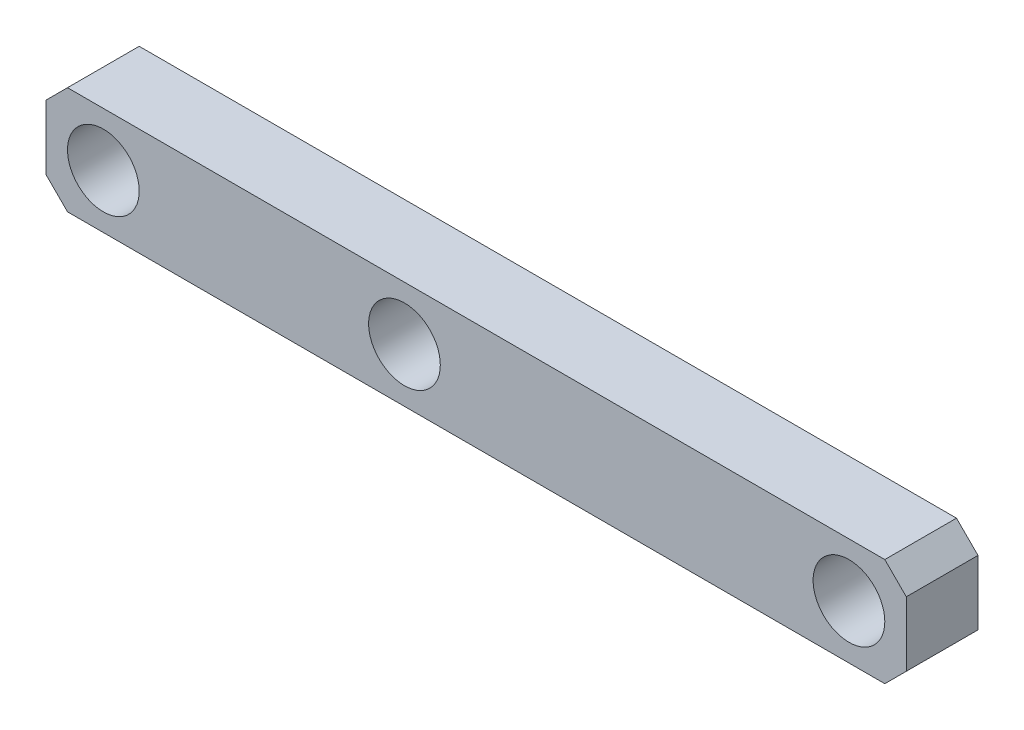
ISO-10303-21;
HEADER;
FILE_DESCRIPTION(('STEP AP214'),'2;1');
FILE_NAME('part.step','',(''),(''),'','','');
FILE_SCHEMA(('AUTOMOTIVE_DESIGN { 1 0 10303 214 1 1 1 1 }'));
ENDSEC;
DATA;
#1=APPLICATION_CONTEXT('core data for automotive mechanical design processes');
#2=APPLICATION_PROTOCOL_DEFINITION('international standard','automotive_design',2000,#1);
#3=PRODUCT_CONTEXT('',#1,'mechanical');
#4=PRODUCT('Part','Part','',(#3));
#5=PRODUCT_RELATED_PRODUCT_CATEGORY('part','',(#4));
#6=PRODUCT_DEFINITION_FORMATION('','',#4);
#7=PRODUCT_DEFINITION_CONTEXT('part definition',#1,'design');
#8=PRODUCT_DEFINITION('design','',#6,#7);
#9=PRODUCT_DEFINITION_SHAPE('','',#8);
#10=(LENGTH_UNIT() NAMED_UNIT(*) SI_UNIT(.MILLI.,.METRE.));
#11=(NAMED_UNIT(*) PLANE_ANGLE_UNIT() SI_UNIT($,.RADIAN.));
#12=(NAMED_UNIT(*) SI_UNIT($,.STERADIAN.) SOLID_ANGLE_UNIT());
#13=UNCERTAINTY_MEASURE_WITH_UNIT(LENGTH_MEASURE(1.E-05),#10,'distance_accuracy_value','');
#14=(GEOMETRIC_REPRESENTATION_CONTEXT(3) GLOBAL_UNCERTAINTY_ASSIGNED_CONTEXT((#13)) GLOBAL_UNIT_ASSIGNED_CONTEXT((#10,
#11,#12)) REPRESENTATION_CONTEXT('',''));
#15=CARTESIAN_POINT('',(0.,0.,0.));
#16=DIRECTION('',(0.,0.,1.));
#17=DIRECTION('',(1.,0.,0.));
#18=AXIS2_PLACEMENT_3D('',#15,#16,#17);
#19=CARTESIAN_POINT('',(0.,0.,10.));
#20=DIRECTION('',(0.,0.,1.));
#21=DIRECTION('',(1.,0.,0.));
#22=AXIS2_PLACEMENT_3D('',#19,#20,#21);
#23=PLANE('',#22);
#24=CARTESIAN_POINT('',(39.0096463022508,6.14951768488746,10.));
#25=DIRECTION('',(0.,0.,1.));
#26=DIRECTION('',(1.,0.,0.));
#27=AXIS2_PLACEMENT_3D('',#24,#25,#26);
#28=CIRCLE('',#27,5.);
#29=CARTESIAN_POINT('',(44.0096463022508,6.14951768488746,10.));
#30=VERTEX_POINT('',#29);
#31=EDGE_CURVE('E187',#30,#30,#28,.T.);
#32=ORIENTED_EDGE('',*,*,#31,.F.);
#33=EDGE_LOOP('',(#32));
#34=FACE_BOUND('',#33,.T.);
#35=DIRECTION('',(1.,0.,0.));
#36=VECTOR('',#35,1.);
#37=CARTESIAN_POINT('',(-72.9903536977492,-1.35048231511253,10.));
#38=LINE('',#37,#36);
#39=CARTESIAN_POINT('',(-69.9903536977492,-1.35048231511253,10.));
#40=VERTEX_POINT('',#39);
#41=CARTESIAN_POINT('',(44.0096463022507,-1.35048231511253,10.));
#42=VERTEX_POINT('',#41);
#43=EDGE_CURVE('E143',#40,#42,#38,.T.);
#44=ORIENTED_EDGE('',*,*,#43,.T.);
#45=DIRECTION('',(-0.707106781186551,-0.707106781186544,0.));
#46=VECTOR('',#45,1.);
#47=CARTESIAN_POINT('',(22.6800643086814,-22.6800643086816,10.));
#48=LINE('',#47,#46);
#49=CARTESIAN_POINT('',(47.0096463022508,1.64951768488748,10.));
#50=VERTEX_POINT('',#49);
#51=EDGE_CURVE('E162',#42,#50,#48,.F.);
#52=ORIENTED_EDGE('',*,*,#51,.T.);
#53=DIRECTION('',(0.,1.,0.));
#54=VECTOR('',#53,1.);
#55=CARTESIAN_POINT('',(47.0096463022508,13.6495176848875,10.));
#56=LINE('',#55,#54);
#57=CARTESIAN_POINT('',(47.0096463022508,10.6495176848874,10.));
#58=VERTEX_POINT('',#57);
#59=EDGE_CURVE('E126',#50,#58,#56,.T.);
#60=ORIENTED_EDGE('',*,*,#59,.T.);
#61=DIRECTION('',(0.707106781186544,-0.707106781186551,0.));
#62=VECTOR('',#61,1.);
#63=CARTESIAN_POINT('',(28.8295819935693,28.8295819935691,10.));
#64=LINE('',#63,#62);
#65=CARTESIAN_POINT('',(44.0096463022508,13.6495176848875,10.));
#66=VERTEX_POINT('',#65);
#67=EDGE_CURVE('E160',#58,#66,#64,.F.);
#68=ORIENTED_EDGE('',*,*,#67,.T.);
#69=DIRECTION('',(-1.,0.,0.));
#70=VECTOR('',#69,1.);
#71=CARTESIAN_POINT('',(-72.9903536977492,13.6495176848875,10.));
#72=LINE('',#71,#70);
#73=CARTESIAN_POINT('',(-69.9903536977492,13.6495176848875,10.));
#74=VERTEX_POINT('',#73);
#75=EDGE_CURVE('E182',#66,#74,#72,.T.);
#76=ORIENTED_EDGE('',*,*,#75,.T.);
#77=DIRECTION('',(0.707106781186551,0.707106781186544,0.));
#78=VECTOR('',#77,1.);
#79=CARTESIAN_POINT('',(-41.819935691318,41.8199356913184,10.));
#80=LINE('',#79,#78);
#81=CARTESIAN_POINT('',(-72.9903536977492,10.6495176848874,10.));
#82=VERTEX_POINT('',#81);
#83=EDGE_CURVE('E61',#74,#82,#80,.F.);
#84=ORIENTED_EDGE('',*,*,#83,.T.);
#85=DIRECTION('',(0.,-1.,0.));
#86=VECTOR('',#85,1.);
#87=CARTESIAN_POINT('',(-72.9903536977492,13.6495176848875,10.));
#88=LINE('',#87,#86);
#89=CARTESIAN_POINT('',(-72.9903536977492,1.64951768488748,10.));
#90=VERTEX_POINT('',#89);
#91=EDGE_CURVE('E172',#82,#90,#88,.T.);
#92=ORIENTED_EDGE('',*,*,#91,.T.);
#93=DIRECTION('',(-0.707106781186544,0.707106781186551,0.));
#94=VECTOR('',#93,1.);
#95=CARTESIAN_POINT('',(-35.6704180064312,-35.6704180064309,10.));
#96=LINE('',#95,#94);
#97=EDGE_CURVE('E158',#90,#40,#96,.F.);
#98=ORIENTED_EDGE('',*,*,#97,.T.);
#99=EDGE_LOOP('',(#44,#52,#60,#68,#76,#84,#92,#98));
#100=FACE_BOUND('',#99,.T.);
#101=CARTESIAN_POINT('',(-64.9903536977492,6.14951768488746,10.));
#102=DIRECTION('',(0.,0.,1.));
#103=DIRECTION('',(1.,0.,0.));
#104=AXIS2_PLACEMENT_3D('',#101,#102,#103);
#105=CIRCLE('',#104,5.);
#106=CARTESIAN_POINT('',(-59.9903536977492,6.14951768488746,10.));
#107=VERTEX_POINT('',#106);
#108=EDGE_CURVE('E134',#107,#107,#105,.T.);
#109=ORIENTED_EDGE('',*,*,#108,.F.);
#110=EDGE_LOOP('',(#109));
#111=FACE_BOUND('',#110,.T.);
#112=CARTESIAN_POINT('',(-22.9903536977492,6.14951768488746,10.));
#113=DIRECTION('',(0.,0.,1.));
#114=DIRECTION('',(1.,0.,0.));
#115=AXIS2_PLACEMENT_3D('',#112,#113,#114);
#116=CIRCLE('',#115,5.);
#117=CARTESIAN_POINT('',(-17.9903536977492,6.14951768488746,10.));
#118=VERTEX_POINT('',#117);
#119=EDGE_CURVE('E192',#118,#118,#116,.T.);
#120=ORIENTED_EDGE('',*,*,#119,.F.);
#121=EDGE_LOOP('',(#120));
#122=FACE_BOUND('',#121,.T.);
#123=ADVANCED_FACE('F40',(#34,#100,#111,#122),#23,.T.);
#124=CARTESIAN_POINT('',(0.,0.,0.));
#125=DIRECTION('',(0.,0.,1.));
#126=DIRECTION('',(1.,0.,0.));
#127=AXIS2_PLACEMENT_3D('',#124,#125,#126);
#128=PLANE('',#127);
#129=DIRECTION('',(0.,1.,0.));
#130=VECTOR('',#129,1.);
#131=CARTESIAN_POINT('',(47.0096463022508,13.6495176848875,0.));
#132=LINE('',#131,#130);
#133=CARTESIAN_POINT('',(47.0096463022508,1.64951768488748,0.));
#134=VERTEX_POINT('',#133);
#135=CARTESIAN_POINT('',(47.0096463022508,10.6495176848874,0.));
#136=VERTEX_POINT('',#135);
#137=EDGE_CURVE('E123',#134,#136,#132,.T.);
#138=ORIENTED_EDGE('',*,*,#137,.F.);
#139=DIRECTION('',(0.707106781186551,0.707106781186544,0.));
#140=VECTOR('',#139,1.);
#141=CARTESIAN_POINT('',(47.0096463022508,1.64951768488748,0.));
#142=LINE('',#141,#140);
#143=CARTESIAN_POINT('',(44.0096463022507,-1.35048231511253,0.));
#144=VERTEX_POINT('',#143);
#145=EDGE_CURVE('E106',#134,#144,#142,.F.);
#146=ORIENTED_EDGE('',*,*,#145,.T.);
#147=DIRECTION('',(1.,0.,0.));
#148=VECTOR('',#147,1.);
#149=CARTESIAN_POINT('',(-72.9903536977492,-1.35048231511253,0.));
#150=LINE('',#149,#148);
#151=CARTESIAN_POINT('',(-69.9903536977492,-1.35048231511253,0.));
#152=VERTEX_POINT('',#151);
#153=EDGE_CURVE('E147',#152,#144,#150,.T.);
#154=ORIENTED_EDGE('',*,*,#153,.F.);
#155=DIRECTION('',(0.707106781186544,-0.707106781186551,0.));
#156=VECTOR('',#155,1.);
#157=CARTESIAN_POINT('',(-69.9903536977492,-1.35048231511253,0.));
#158=LINE('',#157,#156);
#159=CARTESIAN_POINT('',(-72.9903536977492,1.64951768488748,0.));
#160=VERTEX_POINT('',#159);
#161=EDGE_CURVE('E151',#152,#160,#158,.F.);
#162=ORIENTED_EDGE('',*,*,#161,.T.);
#163=DIRECTION('',(0.,-1.,0.));
#164=VECTOR('',#163,1.);
#165=CARTESIAN_POINT('',(-72.9903536977492,13.6495176848875,0.));
#166=LINE('',#165,#164);
#167=CARTESIAN_POINT('',(-72.9903536977492,10.6495176848874,0.));
#168=VERTEX_POINT('',#167);
#169=EDGE_CURVE('E137',#168,#160,#166,.T.);
#170=ORIENTED_EDGE('',*,*,#169,.F.);
#171=DIRECTION('',(-0.707106781186551,-0.707106781186544,0.));
#172=VECTOR('',#171,1.);
#173=CARTESIAN_POINT('',(-72.9903536977492,10.6495176848874,0.));
#174=LINE('',#173,#172);
#175=CARTESIAN_POINT('',(-69.9903536977492,13.6495176848875,0.));
#176=VERTEX_POINT('',#175);
#177=EDGE_CURVE('E127',#168,#176,#174,.F.);
#178=ORIENTED_EDGE('',*,*,#177,.T.);
#179=DIRECTION('',(-1.,0.,0.));
#180=VECTOR('',#179,1.);
#181=CARTESIAN_POINT('',(-72.9903536977492,13.6495176848875,0.));
#182=LINE('',#181,#180);
#183=CARTESIAN_POINT('',(44.0096463022508,13.6495176848875,0.));
#184=VERTEX_POINT('',#183);
#185=EDGE_CURVE('E133',#184,#176,#182,.T.);
#186=ORIENTED_EDGE('',*,*,#185,.F.);
#187=DIRECTION('',(-0.707106781186544,0.707106781186551,0.));
#188=VECTOR('',#187,1.);
#189=CARTESIAN_POINT('',(44.0096463022508,13.6495176848875,0.));
#190=LINE('',#189,#188);
#191=EDGE_CURVE('E117',#184,#136,#190,.F.);
#192=ORIENTED_EDGE('',*,*,#191,.T.);
#193=EDGE_LOOP('',(#138,#146,#154,#162,#170,#178,#186,#192));
#194=FACE_BOUND('',#193,.T.);
#195=CARTESIAN_POINT('',(-64.9903536977492,6.14951768488746,0.));
#196=DIRECTION('',(0.,0.,1.));
#197=DIRECTION('',(1.,0.,0.));
#198=AXIS2_PLACEMENT_3D('',#195,#196,#197);
#199=CIRCLE('',#198,5.);
#200=CARTESIAN_POINT('',(-59.9903536977492,6.14951768488746,0.));
#201=VERTEX_POINT('',#200);
#202=EDGE_CURVE('E140',#201,#201,#199,.T.);
#203=ORIENTED_EDGE('',*,*,#202,.T.);
#204=EDGE_LOOP('',(#203));
#205=FACE_BOUND('',#204,.T.);
#206=CARTESIAN_POINT('',(39.0096463022508,6.14951768488746,0.));
#207=DIRECTION('',(0.,0.,1.));
#208=DIRECTION('',(1.,0.,0.));
#209=AXIS2_PLACEMENT_3D('',#206,#207,#208);
#210=CIRCLE('',#209,5.);
#211=CARTESIAN_POINT('',(44.0096463022508,6.14951768488746,0.));
#212=VERTEX_POINT('',#211);
#213=EDGE_CURVE('E189',#212,#212,#210,.T.);
#214=ORIENTED_EDGE('',*,*,#213,.T.);
#215=EDGE_LOOP('',(#214));
#216=FACE_BOUND('',#215,.T.);
#217=CARTESIAN_POINT('',(-22.9903536977492,6.14951768488746,0.));
#218=DIRECTION('',(0.,0.,1.));
#219=DIRECTION('',(1.,0.,0.));
#220=AXIS2_PLACEMENT_3D('',#217,#218,#219);
#221=CIRCLE('',#220,5.);
#222=CARTESIAN_POINT('',(-17.9903536977492,6.14951768488746,0.));
#223=VERTEX_POINT('',#222);
#224=EDGE_CURVE('E195',#223,#223,#221,.T.);
#225=ORIENTED_EDGE('',*,*,#224,.T.);
#226=EDGE_LOOP('',(#225));
#227=FACE_BOUND('',#226,.T.);
#228=ADVANCED_FACE('F130',(#194,#205,#216,#227),#128,.F.);
#229=CARTESIAN_POINT('',(47.0096463022508,13.6495176848875,10.));
#230=DIRECTION('',(-1.,0.,0.));
#231=DIRECTION('',(0.,0.,1.));
#232=AXIS2_PLACEMENT_3D('',#229,#230,#231);
#233=PLANE('',#232);
#234=ORIENTED_EDGE('',*,*,#59,.F.);
#235=DIRECTION('',(0.,0.,-1.));
#236=VECTOR('',#235,1.);
#237=CARTESIAN_POINT('',(47.0096463022508,1.64951768488748,10.));
#238=LINE('',#237,#236);
#239=EDGE_CURVE('E110',#50,#134,#238,.T.);
#240=ORIENTED_EDGE('',*,*,#239,.T.);
#241=ORIENTED_EDGE('',*,*,#137,.T.);
#242=DIRECTION('',(0.,0.,1.));
#243=VECTOR('',#242,1.);
#244=CARTESIAN_POINT('',(47.0096463022508,10.6495176848874,10.));
#245=LINE('',#244,#243);
#246=EDGE_CURVE('E128',#136,#58,#245,.T.);
#247=ORIENTED_EDGE('',*,*,#246,.T.);
#248=EDGE_LOOP('',(#234,#240,#241,#247));
#249=FACE_BOUND('',#248,.T.);
#250=ADVANCED_FACE('F122',(#249),#233,.F.);
#251=CARTESIAN_POINT('',(-72.9903536977492,13.6495176848875,10.));
#252=DIRECTION('',(0.,-1.,0.));
#253=DIRECTION('',(0.,0.,-1.));
#254=AXIS2_PLACEMENT_3D('',#251,#252,#253);
#255=PLANE('',#254);
#256=ORIENTED_EDGE('',*,*,#75,.F.);
#257=DIRECTION('',(0.,0.,-1.));
#258=VECTOR('',#257,1.);
#259=CARTESIAN_POINT('',(44.0096463022508,13.6495176848875,10.));
#260=LINE('',#259,#258);
#261=EDGE_CURVE('E166',#66,#184,#260,.T.);
#262=ORIENTED_EDGE('',*,*,#261,.T.);
#263=ORIENTED_EDGE('',*,*,#185,.T.);
#264=DIRECTION('',(0.,0.,1.));
#265=VECTOR('',#264,1.);
#266=CARTESIAN_POINT('',(-69.9903536977492,13.6495176848875,10.));
#267=LINE('',#266,#265);
#268=EDGE_CURVE('E164',#176,#74,#267,.T.);
#269=ORIENTED_EDGE('',*,*,#268,.T.);
#270=EDGE_LOOP('',(#256,#262,#263,#269));
#271=FACE_BOUND('',#270,.T.);
#272=ADVANCED_FACE('F220',(#271),#255,.F.);
#273=CARTESIAN_POINT('',(-72.9903536977492,13.6495176848875,10.));
#274=DIRECTION('',(1.,0.,0.));
#275=DIRECTION('',(0.,0.,-1.));
#276=AXIS2_PLACEMENT_3D('',#273,#274,#275);
#277=PLANE('',#276);
#278=ORIENTED_EDGE('',*,*,#169,.T.);
#279=DIRECTION('',(0.,0.,1.));
#280=VECTOR('',#279,1.);
#281=CARTESIAN_POINT('',(-72.9903536977492,1.64951768488748,10.));
#282=LINE('',#281,#280);
#283=EDGE_CURVE('E11',#160,#90,#282,.T.);
#284=ORIENTED_EDGE('',*,*,#283,.T.);
#285=ORIENTED_EDGE('',*,*,#91,.F.);
#286=DIRECTION('',(0.,0.,-1.));
#287=VECTOR('',#286,1.);
#288=CARTESIAN_POINT('',(-72.9903536977492,10.6495176848874,10.));
#289=LINE('',#288,#287);
#290=EDGE_CURVE('E49',#82,#168,#289,.T.);
#291=ORIENTED_EDGE('',*,*,#290,.T.);
#292=EDGE_LOOP('',(#278,#284,#285,#291));
#293=FACE_BOUND('',#292,.T.);
#294=ADVANCED_FACE('F171',(#293),#277,.F.);
#295=CARTESIAN_POINT('',(-72.9903536977492,-1.35048231511253,10.));
#296=DIRECTION('',(0.,1.,0.));
#297=DIRECTION('',(0.,0.,1.));
#298=AXIS2_PLACEMENT_3D('',#295,#296,#297);
#299=PLANE('',#298);
#300=ORIENTED_EDGE('',*,*,#153,.T.);
#301=DIRECTION('',(0.,0.,1.));
#302=VECTOR('',#301,1.);
#303=CARTESIAN_POINT('',(44.0096463022507,-1.35048231511253,10.));
#304=LINE('',#303,#302);
#305=EDGE_CURVE('E111',#144,#42,#304,.T.);
#306=ORIENTED_EDGE('',*,*,#305,.T.);
#307=ORIENTED_EDGE('',*,*,#43,.F.);
#308=DIRECTION('',(0.,0.,-1.));
#309=VECTOR('',#308,1.);
#310=CARTESIAN_POINT('',(-69.9903536977492,-1.35048231511253,10.));
#311=LINE('',#310,#309);
#312=EDGE_CURVE('E116',#40,#152,#311,.T.);
#313=ORIENTED_EDGE('',*,*,#312,.T.);
#314=EDGE_LOOP('',(#300,#306,#307,#313));
#315=FACE_BOUND('',#314,.T.);
#316=ADVANCED_FACE('F180',(#315),#299,.F.);
#317=CARTESIAN_POINT('',(-64.9903536977492,6.14951768488746,10.));
#318=DIRECTION('',(0.,0.,-1.));
#319=DIRECTION('',(-1.,0.,0.));
#320=AXIS2_PLACEMENT_3D('',#317,#318,#319);
#321=CYLINDRICAL_SURFACE('',#320,5.);
#322=ORIENTED_EDGE('',*,*,#108,.T.);
#323=EDGE_LOOP('',(#322));
#324=FACE_BOUND('',#323,.T.);
#325=ORIENTED_EDGE('',*,*,#202,.F.);
#326=EDGE_LOOP('',(#325));
#327=FACE_BOUND('',#326,.T.);
#328=ADVANCED_FACE('F213',(#324,#327),#321,.F.);
#329=CARTESIAN_POINT('',(39.0096463022508,6.14951768488746,10.));
#330=DIRECTION('',(0.,0.,-1.));
#331=DIRECTION('',(-1.,0.,0.));
#332=AXIS2_PLACEMENT_3D('',#329,#330,#331);
#333=CYLINDRICAL_SURFACE('',#332,5.);
#334=ORIENTED_EDGE('',*,*,#31,.T.);
#335=EDGE_LOOP('',(#334));
#336=FACE_BOUND('',#335,.T.);
#337=ORIENTED_EDGE('',*,*,#213,.F.);
#338=EDGE_LOOP('',(#337));
#339=FACE_BOUND('',#338,.T.);
#340=ADVANCED_FACE('F255',(#336,#339),#333,.F.);
#341=CARTESIAN_POINT('',(-22.9903536977492,6.14951768488746,10.));
#342=DIRECTION('',(0.,0.,-1.));
#343=DIRECTION('',(-1.,0.,0.));
#344=AXIS2_PLACEMENT_3D('',#341,#342,#343);
#345=CYLINDRICAL_SURFACE('',#344,5.);
#346=ORIENTED_EDGE('',*,*,#119,.T.);
#347=EDGE_LOOP('',(#346));
#348=FACE_BOUND('',#347,.T.);
#349=ORIENTED_EDGE('',*,*,#224,.F.);
#350=EDGE_LOOP('',(#349));
#351=FACE_BOUND('',#350,.T.);
#352=ADVANCED_FACE('F201',(#348,#351),#345,.F.);
#353=CARTESIAN_POINT('',(47.0096463022508,1.64951768488748,10.));
#354=DIRECTION('',(-0.707106781186544,0.707106781186551,0.));
#355=DIRECTION('',(0.,0.,-1.));
#356=AXIS2_PLACEMENT_3D('',#353,#354,#355);
#357=PLANE('',#356);
#358=ORIENTED_EDGE('',*,*,#51,.F.);
#359=ORIENTED_EDGE('',*,*,#305,.F.);
#360=ORIENTED_EDGE('',*,*,#145,.F.);
#361=ORIENTED_EDGE('',*,*,#239,.F.);
#362=EDGE_LOOP('',(#358,#359,#360,#361));
#363=FACE_BOUND('',#362,.T.);
#364=ADVANCED_FACE('F109',(#363),#357,.F.);
#365=CARTESIAN_POINT('',(44.0096463022508,13.6495176848875,10.));
#366=DIRECTION('',(-0.707106781186551,-0.707106781186544,0.));
#367=DIRECTION('',(0.,0.,-1.));
#368=AXIS2_PLACEMENT_3D('',#365,#366,#367);
#369=PLANE('',#368);
#370=ORIENTED_EDGE('',*,*,#67,.F.);
#371=ORIENTED_EDGE('',*,*,#246,.F.);
#372=ORIENTED_EDGE('',*,*,#191,.F.);
#373=ORIENTED_EDGE('',*,*,#261,.F.);
#374=EDGE_LOOP('',(#370,#371,#372,#373));
#375=FACE_BOUND('',#374,.T.);
#376=ADVANCED_FACE('F232',(#375),#369,.F.);
#377=CARTESIAN_POINT('',(-69.9903536977492,-1.35048231511253,10.));
#378=DIRECTION('',(0.707106781186551,0.707106781186544,0.));
#379=DIRECTION('',(0.,0.,-1.));
#380=AXIS2_PLACEMENT_3D('',#377,#378,#379);
#381=PLANE('',#380);
#382=ORIENTED_EDGE('',*,*,#97,.F.);
#383=ORIENTED_EDGE('',*,*,#283,.F.);
#384=ORIENTED_EDGE('',*,*,#161,.F.);
#385=ORIENTED_EDGE('',*,*,#312,.F.);
#386=EDGE_LOOP('',(#382,#383,#384,#385));
#387=FACE_BOUND('',#386,.T.);
#388=ADVANCED_FACE('F177',(#387),#381,.F.);
#389=CARTESIAN_POINT('',(-72.9903536977492,10.6495176848874,10.));
#390=DIRECTION('',(0.707106781186544,-0.707106781186551,0.));
#391=DIRECTION('',(0.,0.,-1.));
#392=AXIS2_PLACEMENT_3D('',#389,#390,#391);
#393=PLANE('',#392);
#394=ORIENTED_EDGE('',*,*,#83,.F.);
#395=ORIENTED_EDGE('',*,*,#268,.F.);
#396=ORIENTED_EDGE('',*,*,#177,.F.);
#397=ORIENTED_EDGE('',*,*,#290,.F.);
#398=EDGE_LOOP('',(#394,#395,#396,#397));
#399=FACE_BOUND('',#398,.T.);
#400=ADVANCED_FACE('F43',(#399),#393,.F.);
#401=CLOSED_SHELL('',(#123,#228,#250,#272,#294,#316,#328,#340,#352,#364,#376,#388,#400));
#402=MANIFOLD_SOLID_BREP('B2',#401);
#403=ADVANCED_BREP_SHAPE_REPRESENTATION('',(#18,#402),#14);
#404=SHAPE_DEFINITION_REPRESENTATION(#9,#403);
ENDSEC;
END-ISO-10303-21;
